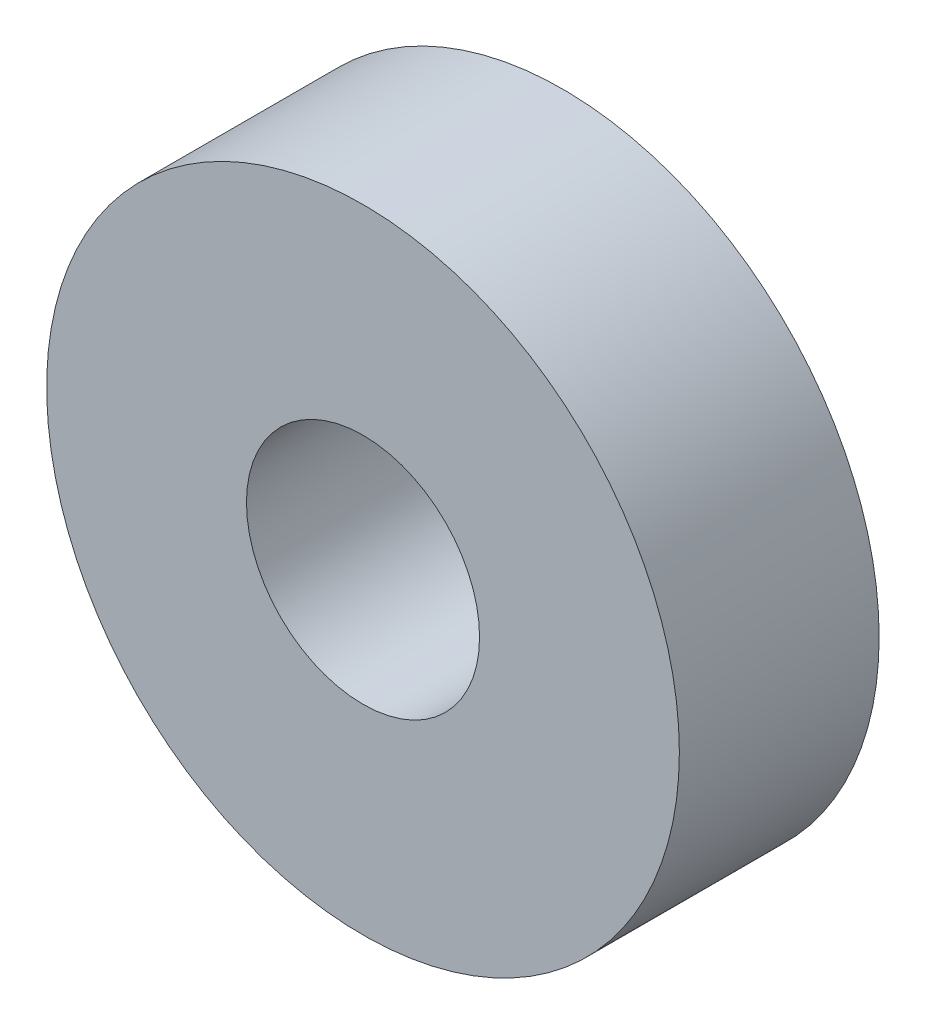
ISO-10303-21;
HEADER;
FILE_DESCRIPTION(('STEP AP214'),'2;1');
FILE_NAME('part.step','',(''),(''),'','','');
FILE_SCHEMA(('AUTOMOTIVE_DESIGN { 1 0 10303 214 1 1 1 1 }'));
ENDSEC;
DATA;
#1=APPLICATION_CONTEXT('core data for automotive mechanical design processes');
#2=APPLICATION_PROTOCOL_DEFINITION('international standard','automotive_design',2000,#1);
#3=PRODUCT_CONTEXT('',#1,'mechanical');
#4=PRODUCT('Part','Part','',(#3));
#5=PRODUCT_RELATED_PRODUCT_CATEGORY('part','',(#4));
#6=PRODUCT_DEFINITION_FORMATION('','',#4);
#7=PRODUCT_DEFINITION_CONTEXT('part definition',#1,'design');
#8=PRODUCT_DEFINITION('design','',#6,#7);
#9=PRODUCT_DEFINITION_SHAPE('','',#8);
#10=(LENGTH_UNIT() NAMED_UNIT(*) SI_UNIT(.MILLI.,.METRE.));
#11=(NAMED_UNIT(*) PLANE_ANGLE_UNIT() SI_UNIT($,.RADIAN.));
#12=(NAMED_UNIT(*) SI_UNIT($,.STERADIAN.) SOLID_ANGLE_UNIT());
#13=UNCERTAINTY_MEASURE_WITH_UNIT(LENGTH_MEASURE(1.E-05),#10,'distance_accuracy_value','');
#14=(GEOMETRIC_REPRESENTATION_CONTEXT(3) GLOBAL_UNCERTAINTY_ASSIGNED_CONTEXT((#13)) GLOBAL_UNIT_ASSIGNED_CONTEXT((#10,
#11,#12)) REPRESENTATION_CONTEXT('',''));
#15=CARTESIAN_POINT('',(0.,0.,0.));
#16=DIRECTION('',(0.,0.,1.));
#17=DIRECTION('',(1.,0.,0.));
#18=AXIS2_PLACEMENT_3D('',#15,#16,#17);
#19=CARTESIAN_POINT('',(-30.6971458434901,0.589360338523193,6.));
#20=DIRECTION('',(0.,0.,-1.));
#21=DIRECTION('',(-1.,0.,0.));
#22=AXIS2_PLACEMENT_3D('',#19,#20,#21);
#23=CYLINDRICAL_SURFACE('',#22,9.5);
#24=CARTESIAN_POINT('',(-30.6971458434901,0.589360338523193,6.));
#25=DIRECTION('',(0.,0.,1.));
#26=DIRECTION('',(1.,0.,0.));
#27=AXIS2_PLACEMENT_3D('',#24,#25,#26);
#28=CIRCLE('',#27,9.5);
#29=CARTESIAN_POINT('',(-21.1971458434901,0.589360338523193,6.));
#30=VERTEX_POINT('',#29);
#31=EDGE_CURVE('E10',#30,#30,#28,.T.);
#32=ORIENTED_EDGE('',*,*,#31,.F.);
#33=EDGE_LOOP('',(#32));
#34=FACE_BOUND('',#33,.T.);
#35=CARTESIAN_POINT('',(-30.6971458434901,0.589360338523193,0.));
#36=DIRECTION('',(0.,0.,1.));
#37=DIRECTION('',(1.,0.,0.));
#38=AXIS2_PLACEMENT_3D('',#35,#36,#37);
#39=CIRCLE('',#38,9.5);
#40=CARTESIAN_POINT('',(-21.1971458434901,0.589360338523193,0.));
#41=VERTEX_POINT('',#40);
#42=EDGE_CURVE('E33',#41,#41,#39,.T.);
#43=ORIENTED_EDGE('',*,*,#42,.T.);
#44=EDGE_LOOP('',(#43));
#45=FACE_BOUND('',#44,.T.);
#46=ADVANCED_FACE('F30',(#34,#45),#23,.T.);
#47=CARTESIAN_POINT('',(-30.6971458434901,0.589360338523193,6.));
#48=DIRECTION('',(0.,0.,1.));
#49=DIRECTION('',(1.,0.,0.));
#50=AXIS2_PLACEMENT_3D('',#47,#48,#49);
#51=PLANE('',#50);
#52=CARTESIAN_POINT('',(-30.6971458434901,0.589360338523193,6.));
#53=DIRECTION('',(0.,0.,1.));
#54=DIRECTION('',(1.,0.,0.));
#55=AXIS2_PLACEMENT_3D('',#52,#53,#54);
#56=CIRCLE('',#55,3.5);
#57=CARTESIAN_POINT('',(-27.1971458434901,0.589360338523193,6.));
#58=VERTEX_POINT('',#57);
#59=EDGE_CURVE('E44',#58,#58,#56,.T.);
#60=ORIENTED_EDGE('',*,*,#59,.F.);
#61=EDGE_LOOP('',(#60));
#62=FACE_BOUND('',#61,.T.);
#63=ORIENTED_EDGE('',*,*,#31,.T.);
#64=EDGE_LOOP('',(#63));
#65=FACE_BOUND('',#64,.T.);
#66=ADVANCED_FACE('F51',(#62,#65),#51,.T.);
#67=CARTESIAN_POINT('',(-30.6971458434901,0.589360338523193,0.));
#68=DIRECTION('',(0.,0.,1.));
#69=DIRECTION('',(1.,0.,0.));
#70=AXIS2_PLACEMENT_3D('',#67,#68,#69);
#71=PLANE('',#70);
#72=CARTESIAN_POINT('',(-30.6971458434901,0.589360338523193,0.));
#73=DIRECTION('',(0.,0.,1.));
#74=DIRECTION('',(1.,0.,0.));
#75=AXIS2_PLACEMENT_3D('',#72,#73,#74);
#76=CIRCLE('',#75,3.5);
#77=CARTESIAN_POINT('',(-27.1971458434901,0.589360338523193,0.));
#78=VERTEX_POINT('',#77);
#79=EDGE_CURVE('E40',#78,#78,#76,.F.);
#80=ORIENTED_EDGE('',*,*,#79,.F.);
#81=EDGE_LOOP('',(#80));
#82=FACE_BOUND('',#81,.T.);
#83=ORIENTED_EDGE('',*,*,#42,.F.);
#84=EDGE_LOOP('',(#83));
#85=FACE_BOUND('',#84,.T.);
#86=ADVANCED_FACE('F53',(#82,#85),#71,.F.);
#87=CARTESIAN_POINT('',(-30.6971458434901,0.589360338523193,-0.00100000000000013));
#88=DIRECTION('',(0.,0.,1.));
#89=DIRECTION('',(1.,0.,0.));
#90=AXIS2_PLACEMENT_3D('',#87,#88,#89);
#91=CYLINDRICAL_SURFACE('',#90,3.5);
#92=CARTESIAN_POINT('',(-27.1971458434901,0.589360338523193,6.));
#93=CARTESIAN_POINT('',(-27.1971458434901,0.589360338523193,5.9375));
#94=CARTESIAN_POINT('',(-27.1971458434901,0.589360338523193,5.875));
#95=CARTESIAN_POINT('',(-27.1971458434901,0.589360338523193,5.75));
#96=CARTESIAN_POINT('',(-27.1971458434901,0.589360338523193,5.6875));
#97=CARTESIAN_POINT('',(-27.1971458434901,0.589360338523193,5.5625));
#98=CARTESIAN_POINT('',(-27.1971458434901,0.589360338523193,5.5));
#99=CARTESIAN_POINT('',(-27.1971458434901,0.589360338523193,5.375));
#100=CARTESIAN_POINT('',(-27.1971458434901,0.589360338523193,5.3125));
#101=CARTESIAN_POINT('',(-27.1971458434901,0.589360338523193,5.1875));
#102=CARTESIAN_POINT('',(-27.1971458434901,0.589360338523193,5.125));
#103=CARTESIAN_POINT('',(-27.1971458434901,0.589360338523193,5.));
#104=CARTESIAN_POINT('',(-27.1971458434901,0.589360338523193,4.9375));
#105=CARTESIAN_POINT('',(-27.1971458434901,0.589360338523193,4.8125));
#106=CARTESIAN_POINT('',(-27.1971458434901,0.589360338523193,4.75));
#107=CARTESIAN_POINT('',(-27.1971458434901,0.589360338523193,4.625));
#108=CARTESIAN_POINT('',(-27.1971458434901,0.589360338523193,4.5625));
#109=CARTESIAN_POINT('',(-27.1971458434901,0.589360338523193,4.4375));
#110=CARTESIAN_POINT('',(-27.1971458434901,0.589360338523193,4.375));
#111=CARTESIAN_POINT('',(-27.1971458434901,0.589360338523193,4.25));
#112=CARTESIAN_POINT('',(-27.1971458434901,0.589360338523193,4.1875));
#113=CARTESIAN_POINT('',(-27.1971458434901,0.589360338523193,4.0625));
#114=CARTESIAN_POINT('',(-27.1971458434901,0.589360338523193,4.));
#115=CARTESIAN_POINT('',(-27.1971458434901,0.589360338523193,3.875));
#116=CARTESIAN_POINT('',(-27.1971458434901,0.589360338523193,3.8125));
#117=CARTESIAN_POINT('',(-27.1971458434901,0.589360338523193,3.6875));
#118=CARTESIAN_POINT('',(-27.1971458434901,0.589360338523193,3.625));
#119=CARTESIAN_POINT('',(-27.1971458434901,0.589360338523193,3.5));
#120=CARTESIAN_POINT('',(-27.1971458434901,0.589360338523193,3.4375));
#121=CARTESIAN_POINT('',(-27.1971458434901,0.589360338523193,3.3125));
#122=CARTESIAN_POINT('',(-27.1971458434901,0.589360338523193,3.25));
#123=CARTESIAN_POINT('',(-27.1971458434901,0.589360338523193,3.125));
#124=CARTESIAN_POINT('',(-27.1971458434901,0.589360338523193,3.0625));
#125=CARTESIAN_POINT('',(-27.1971458434901,0.589360338523193,2.9375));
#126=CARTESIAN_POINT('',(-27.1971458434901,0.589360338523193,2.875));
#127=CARTESIAN_POINT('',(-27.1971458434901,0.589360338523193,2.75));
#128=CARTESIAN_POINT('',(-27.1971458434901,0.589360338523193,2.6875));
#129=CARTESIAN_POINT('',(-27.1971458434901,0.589360338523193,2.5625));
#130=CARTESIAN_POINT('',(-27.1971458434901,0.589360338523193,2.5));
#131=CARTESIAN_POINT('',(-27.1971458434901,0.589360338523193,2.375));
#132=CARTESIAN_POINT('',(-27.1971458434901,0.589360338523193,2.3125));
#133=CARTESIAN_POINT('',(-27.1971458434901,0.589360338523193,2.1875));
#134=CARTESIAN_POINT('',(-27.1971458434901,0.589360338523193,2.125));
#135=CARTESIAN_POINT('',(-27.1971458434901,0.589360338523193,2.));
#136=CARTESIAN_POINT('',(-27.1971458434901,0.589360338523193,1.9375));
#137=CARTESIAN_POINT('',(-27.1971458434901,0.589360338523193,1.8125));
#138=CARTESIAN_POINT('',(-27.1971458434901,0.589360338523193,1.75));
#139=CARTESIAN_POINT('',(-27.1971458434901,0.589360338523193,1.625));
#140=CARTESIAN_POINT('',(-27.1971458434901,0.589360338523193,1.5625));
#141=CARTESIAN_POINT('',(-27.1971458434901,0.589360338523193,1.4375));
#142=CARTESIAN_POINT('',(-27.1971458434901,0.589360338523193,1.375));
#143=CARTESIAN_POINT('',(-27.1971458434901,0.589360338523193,1.25));
#144=CARTESIAN_POINT('',(-27.1971458434901,0.589360338523193,1.1875));
#145=CARTESIAN_POINT('',(-27.1971458434901,0.589360338523193,1.0625));
#146=CARTESIAN_POINT('',(-27.1971458434901,0.589360338523193,1.));
#147=CARTESIAN_POINT('',(-27.1971458434901,0.589360338523193,0.875));
#148=CARTESIAN_POINT('',(-27.1971458434901,0.589360338523193,0.8125));
#149=CARTESIAN_POINT('',(-27.1971458434901,0.589360338523193,0.6875));
#150=CARTESIAN_POINT('',(-27.1971458434901,0.589360338523193,0.625));
#151=CARTESIAN_POINT('',(-27.1971458434901,0.589360338523193,0.5));
#152=CARTESIAN_POINT('',(-27.1971458434901,0.589360338523193,0.4375));
#153=CARTESIAN_POINT('',(-27.1971458434901,0.589360338523193,0.3125));
#154=CARTESIAN_POINT('',(-27.1971458434901,0.589360338523193,0.25));
#155=CARTESIAN_POINT('',(-27.1971458434901,0.589360338523193,0.125));
#156=CARTESIAN_POINT('',(-27.1971458434901,0.589360338523193,0.0625000000000001));
#157=CARTESIAN_POINT('',(-27.1971458434901,0.589360338523193,0.));
#158=B_SPLINE_CURVE_WITH_KNOTS('',3,(#92,#93,#94,#95,#96,#97,#98,#99,#100,#101,#102,#103,#104,
#105,#106,#107,#108,#109,#110,#111,#112,#113,#114,#115,#116,#117,#118,#119,#120,#121,#122,#123,
#124,#125,#126,#127,#128,#129,#130,#131,#132,#133,#134,#135,#136,#137,#138,#139,#140,#141,#142,
#143,#144,#145,#146,#147,#148,#149,#150,#151,#152,#153,#154,#155,#156,#157),.UNSPECIFIED.,.F.,
.F.,(4,2,2,2,2,2,2,2,2,2,2,2,2,2,2,2,2,2,2,2,2,2,2,2,2,2,2,2,2,2,2,2,4),(0.,0.1875,0.375,0.5625,
0.75,0.9375,1.125,1.3125,1.5,1.6875,1.875,2.0625,2.25,2.4375,2.625,2.8125,3.,3.1875,3.375,
3.5625,3.75,3.9375,4.125,4.3125,4.5,4.6875,4.875,5.0625,5.25,5.4375,5.625,5.8125,6.),.UNSPECIFIED.);
#159=EDGE_CURVE('BSEAM48',#58,#78,#158,.T.);
#160=ORIENTED_EDGE('',*,*,#59,.T.);
#161=ORIENTED_EDGE('',*,*,#79,.T.);
#162=ORIENTED_EDGE('',*,*,#159,.T.);
#163=ORIENTED_EDGE('',*,*,#159,.F.);
#164=EDGE_LOOP('',(#160,#162,#161,#163));
#165=FACE_BOUND('',#164,.T.);
#166=ADVANCED_FACE('F48',(#165),#91,.F.);
#167=CLOSED_SHELL('',(#46,#66,#86,#166));
#168=MANIFOLD_SOLID_BREP('B2',#167);
#169=ADVANCED_BREP_SHAPE_REPRESENTATION('',(#18,#168),#14);
#170=SHAPE_DEFINITION_REPRESENTATION(#9,#169);
ENDSEC;
END-ISO-10303-21;
